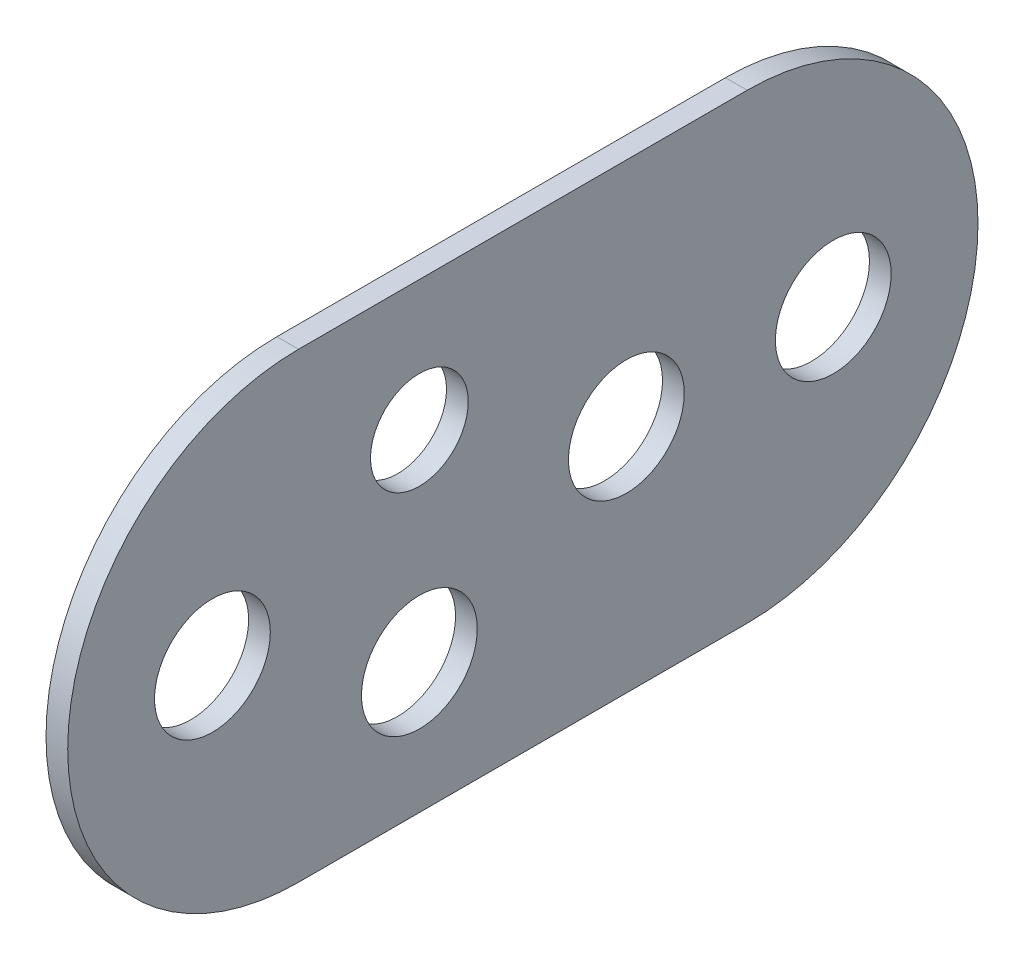
ISO-10303-21;
HEADER;
FILE_DESCRIPTION(('STEP AP214'),'2;1');
FILE_NAME('part.step','',(''),(''),'','','');
FILE_SCHEMA(('AUTOMOTIVE_DESIGN { 1 0 10303 214 1 1 1 1 }'));
ENDSEC;
DATA;
#1=APPLICATION_CONTEXT('core data for automotive mechanical design processes');
#2=APPLICATION_PROTOCOL_DEFINITION('international standard','automotive_design',2000,#1);
#3=PRODUCT_CONTEXT('',#1,'mechanical');
#4=PRODUCT('Part','Part','',(#3));
#5=PRODUCT_RELATED_PRODUCT_CATEGORY('part','',(#4));
#6=PRODUCT_DEFINITION_FORMATION('','',#4);
#7=PRODUCT_DEFINITION_CONTEXT('part definition',#1,'design');
#8=PRODUCT_DEFINITION('design','',#6,#7);
#9=PRODUCT_DEFINITION_SHAPE('','',#8);
#10=(LENGTH_UNIT() NAMED_UNIT(*) SI_UNIT(.MILLI.,.METRE.));
#11=(NAMED_UNIT(*) PLANE_ANGLE_UNIT() SI_UNIT($,.RADIAN.));
#12=(NAMED_UNIT(*) SI_UNIT($,.STERADIAN.) SOLID_ANGLE_UNIT());
#13=UNCERTAINTY_MEASURE_WITH_UNIT(LENGTH_MEASURE(1.E-05),#10,'distance_accuracy_value','');
#14=(GEOMETRIC_REPRESENTATION_CONTEXT(3) GLOBAL_UNCERTAINTY_ASSIGNED_CONTEXT((#13)) GLOBAL_UNIT_ASSIGNED_CONTEXT((#10,
#11,#12)) REPRESENTATION_CONTEXT('',''));
#15=CARTESIAN_POINT('',(0.,0.,0.));
#16=DIRECTION('',(0.,0.,1.));
#17=DIRECTION('',(1.,0.,0.));
#18=AXIS2_PLACEMENT_3D('',#15,#16,#17);
#19=CARTESIAN_POINT('',(1.5,0.,31.));
#20=DIRECTION('',(-1.,0.,0.));
#21=DIRECTION('',(0.,0.,1.));
#22=AXIS2_PLACEMENT_3D('',#19,#20,#21);
#23=CYLINDRICAL_SURFACE('',#22,31.9);
#24=CARTESIAN_POINT('',(-1.5,0.,31.));
#25=DIRECTION('',(1.,0.,0.));
#26=DIRECTION('',(0.,0.,-1.));
#27=AXIS2_PLACEMENT_3D('',#24,#25,#26);
#28=CIRCLE('',#27,31.9);
#29=CARTESIAN_POINT('',(-1.5,31.9,31.));
#30=VERTEX_POINT('',#29);
#31=CARTESIAN_POINT('',(-1.5,-31.9,31.));
#32=VERTEX_POINT('',#31);
#33=EDGE_CURVE('E104',#30,#32,#28,.T.);
#34=ORIENTED_EDGE('',*,*,#33,.T.);
#35=DIRECTION('',(-1.,0.,0.));
#36=VECTOR('',#35,1.);
#37=CARTESIAN_POINT('',(1.5,-31.9,31.));
#38=LINE('',#37,#36);
#39=CARTESIAN_POINT('',(1.5,-31.9,31.));
#40=VERTEX_POINT('',#39);
#41=EDGE_CURVE('E11',#40,#32,#38,.T.);
#42=ORIENTED_EDGE('',*,*,#41,.F.);
#43=CARTESIAN_POINT('',(1.5,0.,31.));
#44=DIRECTION('',(1.,0.,0.));
#45=DIRECTION('',(0.,0.,-1.));
#46=AXIS2_PLACEMENT_3D('',#43,#44,#45);
#47=CIRCLE('',#46,31.9);
#48=CARTESIAN_POINT('',(1.5,31.9,31.));
#49=VERTEX_POINT('',#48);
#50=EDGE_CURVE('E92',#49,#40,#47,.T.);
#51=ORIENTED_EDGE('',*,*,#50,.F.);
#52=DIRECTION('',(-1.,0.,0.));
#53=VECTOR('',#52,1.);
#54=CARTESIAN_POINT('',(1.5,31.9,31.));
#55=LINE('',#54,#53);
#56=EDGE_CURVE('E100',#49,#30,#55,.T.);
#57=ORIENTED_EDGE('',*,*,#56,.T.);
#58=EDGE_LOOP('',(#34,#42,#51,#57));
#59=FACE_BOUND('',#58,.T.);
#60=ADVANCED_FACE('F41',(#59),#23,.T.);
#61=CARTESIAN_POINT('',(1.5,-31.9,31.));
#62=DIRECTION('',(0.,1.,0.));
#63=DIRECTION('',(0.,0.,1.));
#64=AXIS2_PLACEMENT_3D('',#61,#62,#63);
#65=PLANE('',#64);
#66=DIRECTION('',(0.,0.,-1.));
#67=VECTOR('',#66,1.);
#68=CARTESIAN_POINT('',(-1.5,-31.9,31.));
#69=LINE('',#68,#67);
#70=CARTESIAN_POINT('',(-1.5,-31.9,-31.));
#71=VERTEX_POINT('',#70);
#72=EDGE_CURVE('E96',#32,#71,#69,.T.);
#73=ORIENTED_EDGE('',*,*,#72,.T.);
#74=DIRECTION('',(-1.,0.,0.));
#75=VECTOR('',#74,1.);
#76=CARTESIAN_POINT('',(1.5,-31.9,-31.));
#77=LINE('',#76,#75);
#78=CARTESIAN_POINT('',(1.5,-31.9,-31.));
#79=VERTEX_POINT('',#78);
#80=EDGE_CURVE('E49',#79,#71,#77,.T.);
#81=ORIENTED_EDGE('',*,*,#80,.F.);
#82=DIRECTION('',(0.,0.,-1.));
#83=VECTOR('',#82,1.);
#84=CARTESIAN_POINT('',(1.5,-31.9,31.));
#85=LINE('',#84,#83);
#86=EDGE_CURVE('E87',#40,#79,#85,.T.);
#87=ORIENTED_EDGE('',*,*,#86,.F.);
#88=ORIENTED_EDGE('',*,*,#41,.T.);
#89=EDGE_LOOP('',(#73,#81,#87,#88));
#90=FACE_BOUND('',#89,.T.);
#91=ADVANCED_FACE('F95',(#90),#65,.F.);
#92=CARTESIAN_POINT('',(1.5,0.,-31.));
#93=DIRECTION('',(-1.,0.,0.));
#94=DIRECTION('',(0.,0.,1.));
#95=AXIS2_PLACEMENT_3D('',#92,#93,#94);
#96=CYLINDRICAL_SURFACE('',#95,31.9);
#97=CARTESIAN_POINT('',(-1.5,0.,-31.));
#98=DIRECTION('',(1.,0.,0.));
#99=DIRECTION('',(0.,0.,-1.));
#100=AXIS2_PLACEMENT_3D('',#97,#98,#99);
#101=CIRCLE('',#100,31.9);
#102=CARTESIAN_POINT('',(-1.5,31.9,-31.));
#103=VERTEX_POINT('',#102);
#104=EDGE_CURVE('E74',#71,#103,#101,.T.);
#105=ORIENTED_EDGE('',*,*,#104,.T.);
#106=DIRECTION('',(-1.,0.,0.));
#107=VECTOR('',#106,1.);
#108=CARTESIAN_POINT('',(1.5,31.9,-31.));
#109=LINE('',#108,#107);
#110=CARTESIAN_POINT('',(1.5,31.9,-31.));
#111=VERTEX_POINT('',#110);
#112=EDGE_CURVE('E97',#111,#103,#109,.T.);
#113=ORIENTED_EDGE('',*,*,#112,.F.);
#114=CARTESIAN_POINT('',(1.5,0.,-31.));
#115=DIRECTION('',(1.,0.,0.));
#116=DIRECTION('',(0.,0.,-1.));
#117=AXIS2_PLACEMENT_3D('',#114,#115,#116);
#118=CIRCLE('',#117,31.9);
#119=EDGE_CURVE('E90',#79,#111,#118,.T.);
#120=ORIENTED_EDGE('',*,*,#119,.F.);
#121=ORIENTED_EDGE('',*,*,#80,.T.);
#122=EDGE_LOOP('',(#105,#113,#120,#121));
#123=FACE_BOUND('',#122,.T.);
#124=ADVANCED_FACE('F98',(#123),#96,.T.);
#125=CARTESIAN_POINT('',(1.5,31.9,31.));
#126=DIRECTION('',(0.,-1.,0.));
#127=DIRECTION('',(0.,0.,-1.));
#128=AXIS2_PLACEMENT_3D('',#125,#126,#127);
#129=PLANE('',#128);
#130=DIRECTION('',(0.,0.,1.));
#131=VECTOR('',#130,1.);
#132=CARTESIAN_POINT('',(-1.5,31.9,31.));
#133=LINE('',#132,#131);
#134=EDGE_CURVE('E80',#103,#30,#133,.T.);
#135=ORIENTED_EDGE('',*,*,#134,.T.);
#136=ORIENTED_EDGE('',*,*,#56,.F.);
#137=DIRECTION('',(0.,0.,1.));
#138=VECTOR('',#137,1.);
#139=CARTESIAN_POINT('',(1.5,31.9,31.));
#140=LINE('',#139,#138);
#141=EDGE_CURVE('E57',#111,#49,#140,.T.);
#142=ORIENTED_EDGE('',*,*,#141,.F.);
#143=ORIENTED_EDGE('',*,*,#112,.T.);
#144=EDGE_LOOP('',(#135,#136,#142,#143));
#145=FACE_BOUND('',#144,.T.);
#146=ADVANCED_FACE('F112',(#145),#129,.F.);
#147=CARTESIAN_POINT('',(1.5,0.,31.));
#148=DIRECTION('',(1.,0.,0.));
#149=DIRECTION('',(0.,0.,-1.));
#150=AXIS2_PLACEMENT_3D('',#147,#148,#149);
#151=PLANE('',#150);
#152=CARTESIAN_POINT('',(1.5,0.,42.9));
#153=DIRECTION('',(1.,0.,0.));
#154=DIRECTION('',(0.,0.,-1.));
#155=AXIS2_PLACEMENT_3D('',#152,#153,#154);
#156=CIRCLE('',#155,8.);
#157=CARTESIAN_POINT('',(1.5,0.,34.9));
#158=VERTEX_POINT('',#157);
#159=EDGE_CURVE('E142',#158,#158,#156,.T.);
#160=ORIENTED_EDGE('',*,*,#159,.F.);
#161=EDGE_LOOP('',(#160));
#162=FACE_BOUND('',#161,.T.);
#163=CARTESIAN_POINT('',(1.5,0.,-42.9));
#164=DIRECTION('',(1.,0.,0.));
#165=DIRECTION('',(0.,0.,-1.));
#166=AXIS2_PLACEMENT_3D('',#163,#164,#165);
#167=CIRCLE('',#166,8.);
#168=CARTESIAN_POINT('',(1.5,0.,-50.9));
#169=VERTEX_POINT('',#168);
#170=EDGE_CURVE('E139',#169,#169,#167,.T.);
#171=ORIENTED_EDGE('',*,*,#170,.F.);
#172=EDGE_LOOP('',(#171));
#173=FACE_BOUND('',#172,.T.);
#174=CARTESIAN_POINT('',(1.5,0.,-14.3));
#175=DIRECTION('',(1.,0.,0.));
#176=DIRECTION('',(0.,0.,-1.));
#177=AXIS2_PLACEMENT_3D('',#174,#175,#176);
#178=CIRCLE('',#177,8.);
#179=CARTESIAN_POINT('',(1.5,0.,-22.3));
#180=VERTEX_POINT('',#179);
#181=EDGE_CURVE('E133',#180,#180,#178,.T.);
#182=ORIENTED_EDGE('',*,*,#181,.F.);
#183=EDGE_LOOP('',(#182));
#184=FACE_BOUND('',#183,.T.);
#185=CARTESIAN_POINT('',(1.5,13.9,14.3));
#186=DIRECTION('',(1.,0.,0.));
#187=DIRECTION('',(0.,0.,-1.));
#188=AXIS2_PLACEMENT_3D('',#185,#186,#187);
#189=CIRCLE('',#188,6.75);
#190=CARTESIAN_POINT('',(1.5,13.9,7.55));
#191=VERTEX_POINT('',#190);
#192=EDGE_CURVE('E127',#191,#191,#189,.T.);
#193=ORIENTED_EDGE('',*,*,#192,.F.);
#194=EDGE_LOOP('',(#193));
#195=FACE_BOUND('',#194,.T.);
#196=CARTESIAN_POINT('',(1.5,-13.9,14.3));
#197=DIRECTION('',(1.,0.,0.));
#198=DIRECTION('',(0.,0.,-1.));
#199=AXIS2_PLACEMENT_3D('',#196,#197,#198);
#200=CIRCLE('',#199,8.);
#201=CARTESIAN_POINT('',(1.5,-13.9,6.3));
#202=VERTEX_POINT('',#201);
#203=EDGE_CURVE('E121',#202,#202,#200,.T.);
#204=ORIENTED_EDGE('',*,*,#203,.F.);
#205=EDGE_LOOP('',(#204));
#206=FACE_BOUND('',#205,.T.);
#207=ORIENTED_EDGE('',*,*,#50,.T.);
#208=ORIENTED_EDGE('',*,*,#86,.T.);
#209=ORIENTED_EDGE('',*,*,#119,.T.);
#210=ORIENTED_EDGE('',*,*,#141,.T.);
#211=EDGE_LOOP('',(#207,#208,#209,#210));
#212=FACE_BOUND('',#211,.T.);
#213=ADVANCED_FACE('F88',(#162,#173,#184,#195,#206,#212),#151,.T.);
#214=CARTESIAN_POINT('',(-1.5,0.,31.));
#215=DIRECTION('',(1.,0.,0.));
#216=DIRECTION('',(0.,0.,-1.));
#217=AXIS2_PLACEMENT_3D('',#214,#215,#216);
#218=PLANE('',#217);
#219=CARTESIAN_POINT('',(-1.50000000000001,0.,42.9));
#220=DIRECTION('',(1.,0.,0.));
#221=DIRECTION('',(0.,0.,-1.));
#222=AXIS2_PLACEMENT_3D('',#219,#220,#221);
#223=CIRCLE('',#222,8.);
#224=CARTESIAN_POINT('',(-1.50000000000001,0.,34.9));
#225=VERTEX_POINT('',#224);
#226=EDGE_CURVE('E107',#225,#225,#223,.T.);
#227=ORIENTED_EDGE('',*,*,#226,.T.);
#228=EDGE_LOOP('',(#227));
#229=FACE_BOUND('',#228,.T.);
#230=CARTESIAN_POINT('',(-1.5,0.,-42.9));
#231=DIRECTION('',(1.,0.,0.));
#232=DIRECTION('',(0.,0.,-1.));
#233=AXIS2_PLACEMENT_3D('',#230,#231,#232);
#234=CIRCLE('',#233,8.);
#235=CARTESIAN_POINT('',(-1.5,0.,-50.9));
#236=VERTEX_POINT('',#235);
#237=EDGE_CURVE('E136',#236,#236,#234,.T.);
#238=ORIENTED_EDGE('',*,*,#237,.T.);
#239=EDGE_LOOP('',(#238));
#240=FACE_BOUND('',#239,.T.);
#241=CARTESIAN_POINT('',(-1.5,0.,-14.3));
#242=DIRECTION('',(1.,0.,0.));
#243=DIRECTION('',(0.,0.,-1.));
#244=AXIS2_PLACEMENT_3D('',#241,#242,#243);
#245=CIRCLE('',#244,8.);
#246=CARTESIAN_POINT('',(-1.5,0.,-22.3));
#247=VERTEX_POINT('',#246);
#248=EDGE_CURVE('E130',#247,#247,#245,.T.);
#249=ORIENTED_EDGE('',*,*,#248,.T.);
#250=EDGE_LOOP('',(#249));
#251=FACE_BOUND('',#250,.T.);
#252=CARTESIAN_POINT('',(-1.5,13.9,14.3));
#253=DIRECTION('',(1.,0.,0.));
#254=DIRECTION('',(0.,0.,-1.));
#255=AXIS2_PLACEMENT_3D('',#252,#253,#254);
#256=CIRCLE('',#255,6.75);
#257=CARTESIAN_POINT('',(-1.5,13.9,7.55));
#258=VERTEX_POINT('',#257);
#259=EDGE_CURVE('E124',#258,#258,#256,.T.);
#260=ORIENTED_EDGE('',*,*,#259,.T.);
#261=EDGE_LOOP('',(#260));
#262=FACE_BOUND('',#261,.T.);
#263=CARTESIAN_POINT('',(-1.5,-13.9,14.3));
#264=DIRECTION('',(1.,0.,0.));
#265=DIRECTION('',(0.,0.,-1.));
#266=AXIS2_PLACEMENT_3D('',#263,#264,#265);
#267=CIRCLE('',#266,8.);
#268=CARTESIAN_POINT('',(-1.5,-13.9,6.3));
#269=VERTEX_POINT('',#268);
#270=EDGE_CURVE('E118',#269,#269,#267,.T.);
#271=ORIENTED_EDGE('',*,*,#270,.T.);
#272=EDGE_LOOP('',(#271));
#273=FACE_BOUND('',#272,.T.);
#274=ORIENTED_EDGE('',*,*,#33,.F.);
#275=ORIENTED_EDGE('',*,*,#134,.F.);
#276=ORIENTED_EDGE('',*,*,#104,.F.);
#277=ORIENTED_EDGE('',*,*,#72,.F.);
#278=EDGE_LOOP('',(#274,#275,#276,#277));
#279=FACE_BOUND('',#278,.T.);
#280=ADVANCED_FACE('F115',(#229,#240,#251,#262,#273,#279),#218,.F.);
#281=CARTESIAN_POINT('',(-1.5,-13.9,14.3));
#282=DIRECTION('',(1.,0.,0.));
#283=DIRECTION('',(0.,0.,-1.));
#284=AXIS2_PLACEMENT_3D('',#281,#282,#283);
#285=CYLINDRICAL_SURFACE('',#284,8.);
#286=ORIENTED_EDGE('',*,*,#270,.F.);
#287=EDGE_LOOP('',(#286));
#288=FACE_BOUND('',#287,.T.);
#289=ORIENTED_EDGE('',*,*,#203,.T.);
#290=EDGE_LOOP('',(#289));
#291=FACE_BOUND('',#290,.T.);
#292=ADVANCED_FACE('F168',(#288,#291),#285,.F.);
#293=CARTESIAN_POINT('',(-1.5,13.9,14.3));
#294=DIRECTION('',(1.,0.,0.));
#295=DIRECTION('',(0.,0.,-1.));
#296=AXIS2_PLACEMENT_3D('',#293,#294,#295);
#297=CYLINDRICAL_SURFACE('',#296,6.75);
#298=ORIENTED_EDGE('',*,*,#259,.F.);
#299=EDGE_LOOP('',(#298));
#300=FACE_BOUND('',#299,.T.);
#301=ORIENTED_EDGE('',*,*,#192,.T.);
#302=EDGE_LOOP('',(#301));
#303=FACE_BOUND('',#302,.T.);
#304=ADVANCED_FACE('F170',(#300,#303),#297,.F.);
#305=CARTESIAN_POINT('',(-1.5,0.,-14.3));
#306=DIRECTION('',(1.,0.,0.));
#307=DIRECTION('',(0.,0.,-1.));
#308=AXIS2_PLACEMENT_3D('',#305,#306,#307);
#309=CYLINDRICAL_SURFACE('',#308,8.);
#310=ORIENTED_EDGE('',*,*,#248,.F.);
#311=EDGE_LOOP('',(#310));
#312=FACE_BOUND('',#311,.T.);
#313=ORIENTED_EDGE('',*,*,#181,.T.);
#314=EDGE_LOOP('',(#313));
#315=FACE_BOUND('',#314,.T.);
#316=ADVANCED_FACE('F177',(#312,#315),#309,.F.);
#317=CARTESIAN_POINT('',(-1.5,0.,-42.9));
#318=DIRECTION('',(1.,0.,0.));
#319=DIRECTION('',(0.,0.,-1.));
#320=AXIS2_PLACEMENT_3D('',#317,#318,#319);
#321=CYLINDRICAL_SURFACE('',#320,8.);
#322=ORIENTED_EDGE('',*,*,#237,.F.);
#323=EDGE_LOOP('',(#322));
#324=FACE_BOUND('',#323,.T.);
#325=ORIENTED_EDGE('',*,*,#170,.T.);
#326=EDGE_LOOP('',(#325));
#327=FACE_BOUND('',#326,.T.);
#328=ADVANCED_FACE('F153',(#324,#327),#321,.F.);
#329=CARTESIAN_POINT('',(-1.50000000000001,0.,42.9));
#330=DIRECTION('',(1.,0.,0.));
#331=DIRECTION('',(0.,0.,-1.));
#332=AXIS2_PLACEMENT_3D('',#329,#330,#331);
#333=CYLINDRICAL_SURFACE('',#332,8.);
#334=ORIENTED_EDGE('',*,*,#226,.F.);
#335=EDGE_LOOP('',(#334));
#336=FACE_BOUND('',#335,.T.);
#337=ORIENTED_EDGE('',*,*,#159,.T.);
#338=EDGE_LOOP('',(#337));
#339=FACE_BOUND('',#338,.T.);
#340=ADVANCED_FACE('F150',(#336,#339),#333,.F.);
#341=CLOSED_SHELL('',(#60,#91,#124,#146,#213,#280,#292,#304,#316,#328,#340));
#342=MANIFOLD_SOLID_BREP('B2',#341);
#343=ADVANCED_BREP_SHAPE_REPRESENTATION('',(#18,#342),#14);
#344=SHAPE_DEFINITION_REPRESENTATION(#9,#343);
ENDSEC;
END-ISO-10303-21;
